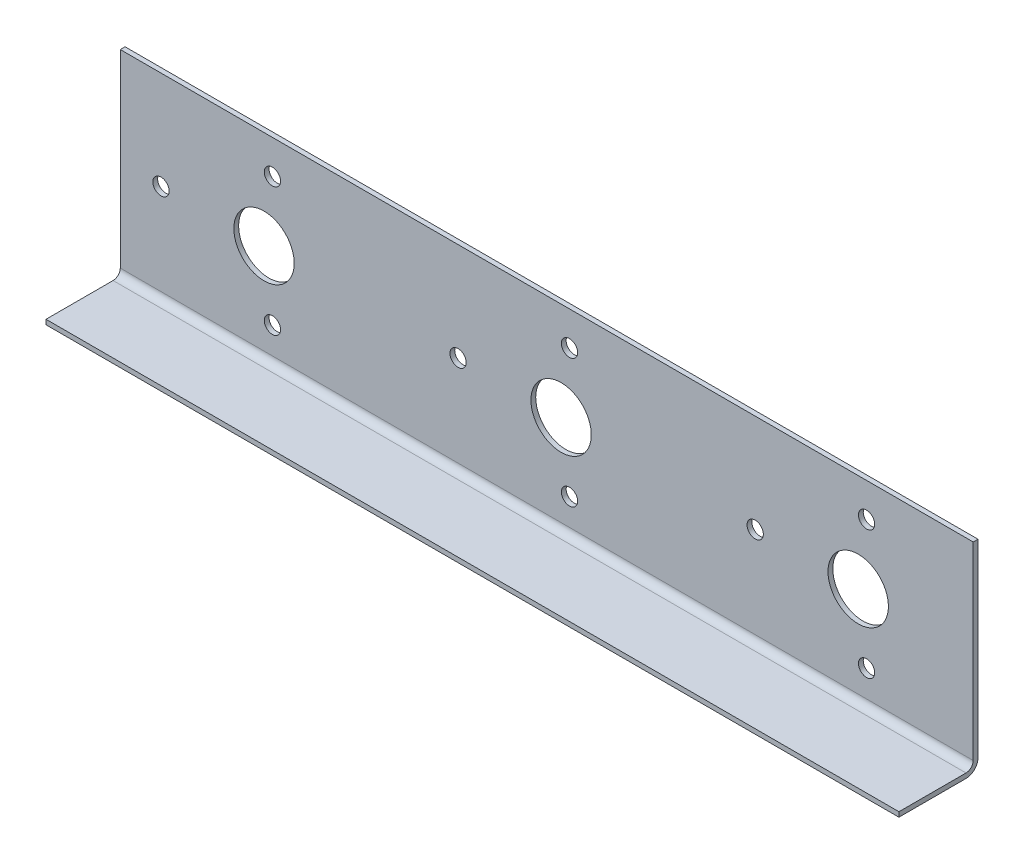
ISO-10303-21;
HEADER;
FILE_DESCRIPTION(('STEP AP214'),'2;1');
FILE_NAME('part.step','',(''),(''),'','','');
FILE_SCHEMA(('AUTOMOTIVE_DESIGN { 1 0 10303 214 1 1 1 1 }'));
ENDSEC;
DATA;
#1=APPLICATION_CONTEXT('core data for automotive mechanical design processes');
#2=APPLICATION_PROTOCOL_DEFINITION('international standard','automotive_design',2000,#1);
#3=PRODUCT_CONTEXT('',#1,'mechanical');
#4=PRODUCT('Part','Part','',(#3));
#5=PRODUCT_RELATED_PRODUCT_CATEGORY('part','',(#4));
#6=PRODUCT_DEFINITION_FORMATION('','',#4);
#7=PRODUCT_DEFINITION_CONTEXT('part definition',#1,'design');
#8=PRODUCT_DEFINITION('design','',#6,#7);
#9=PRODUCT_DEFINITION_SHAPE('','',#8);
#10=(LENGTH_UNIT() NAMED_UNIT(*) SI_UNIT(.MILLI.,.METRE.));
#11=(NAMED_UNIT(*) PLANE_ANGLE_UNIT() SI_UNIT($,.RADIAN.));
#12=(NAMED_UNIT(*) SI_UNIT($,.STERADIAN.) SOLID_ANGLE_UNIT());
#13=UNCERTAINTY_MEASURE_WITH_UNIT(LENGTH_MEASURE(1.E-05),#10,'distance_accuracy_value','');
#14=(GEOMETRIC_REPRESENTATION_CONTEXT(3) GLOBAL_UNCERTAINTY_ASSIGNED_CONTEXT((#13)) GLOBAL_UNIT_ASSIGNED_CONTEXT((#10,
#11,#12)) REPRESENTATION_CONTEXT('',''));
#15=CARTESIAN_POINT('',(0.,0.,0.));
#16=DIRECTION('',(0.,0.,1.));
#17=DIRECTION('',(1.,0.,0.));
#18=AXIS2_PLACEMENT_3D('',#15,#16,#17);
#19=CARTESIAN_POINT('',(-60.25,41.923393758659,-98.));
#20=DIRECTION('',(0.,0.,-1.));
#21=DIRECTION('',(-1.,0.,0.));
#22=AXIS2_PLACEMENT_3D('',#19,#20,#21);
#23=CYLINDRICAL_SURFACE('',#22,1.7);
#24=CARTESIAN_POINT('',(-60.25,41.923393758659,-101.));
#25=DIRECTION('',(0.,0.,-1.));
#26=DIRECTION('',(-1.,0.,0.));
#27=AXIS2_PLACEMENT_3D('',#24,#25,#26);
#28=CIRCLE('',#27,1.7);
#29=CARTESIAN_POINT('',(-61.95,41.923393758659,-101.));
#30=VERTEX_POINT('',#29);
#31=EDGE_CURVE('E259',#30,#30,#28,.T.);
#32=ORIENTED_EDGE('',*,*,#31,.T.);
#33=EDGE_LOOP('',(#32));
#34=FACE_BOUND('',#33,.T.);
#35=CARTESIAN_POINT('',(-60.25,41.923393758659,-100.));
#36=DIRECTION('',(0.,0.,-1.));
#37=DIRECTION('',(-1.,0.,0.));
#38=AXIS2_PLACEMENT_3D('',#35,#36,#37);
#39=CIRCLE('',#38,1.7);
#40=CARTESIAN_POINT('',(-61.95,41.923393758659,-100.));
#41=VERTEX_POINT('',#40);
#42=EDGE_CURVE('E157',#41,#41,#39,.T.);
#43=ORIENTED_EDGE('',*,*,#42,.F.);
#44=EDGE_LOOP('',(#43));
#45=FACE_BOUND('',#44,.T.);
#46=ADVANCED_FACE('F17',(#34,#45),#23,.F.);
#47=CARTESIAN_POINT('',(-83.5,28.5,-98.));
#48=DIRECTION('',(0.,0.,-1.));
#49=DIRECTION('',(-1.,0.,0.));
#50=AXIS2_PLACEMENT_3D('',#47,#48,#49);
#51=CYLINDRICAL_SURFACE('',#50,1.7);
#52=CARTESIAN_POINT('',(-83.5,28.5,-101.));
#53=DIRECTION('',(0.,0.,-1.));
#54=DIRECTION('',(-1.,0.,0.));
#55=AXIS2_PLACEMENT_3D('',#52,#53,#54);
#56=CIRCLE('',#55,1.7);
#57=CARTESIAN_POINT('',(-85.2,28.5,-101.));
#58=VERTEX_POINT('',#57);
#59=EDGE_CURVE('E255',#58,#58,#56,.T.);
#60=ORIENTED_EDGE('',*,*,#59,.T.);
#61=EDGE_LOOP('',(#60));
#62=FACE_BOUND('',#61,.T.);
#63=CARTESIAN_POINT('',(-83.5,28.5,-100.));
#64=DIRECTION('',(0.,0.,-1.));
#65=DIRECTION('',(-1.,0.,0.));
#66=AXIS2_PLACEMENT_3D('',#63,#64,#65);
#67=CIRCLE('',#66,1.7);
#68=CARTESIAN_POINT('',(-85.2,28.5,-100.));
#69=VERTEX_POINT('',#68);
#70=EDGE_CURVE('E153',#69,#69,#67,.T.);
#71=ORIENTED_EDGE('',*,*,#70,.F.);
#72=EDGE_LOOP('',(#71));
#73=FACE_BOUND('',#72,.T.);
#74=ADVANCED_FACE('F364',(#62,#73),#51,.F.);
#75=CARTESIAN_POINT('',(-62.,28.5,-98.));
#76=DIRECTION('',(0.,0.,-1.));
#77=DIRECTION('',(-1.,0.,0.));
#78=AXIS2_PLACEMENT_3D('',#75,#76,#77);
#79=CYLINDRICAL_SURFACE('',#78,6.3);
#80=CARTESIAN_POINT('',(-62.,28.5,-101.));
#81=DIRECTION('',(0.,0.,-1.));
#82=DIRECTION('',(-1.,0.,0.));
#83=AXIS2_PLACEMENT_3D('',#80,#81,#82);
#84=CIRCLE('',#83,6.3);
#85=CARTESIAN_POINT('',(-68.3,28.5,-101.));
#86=VERTEX_POINT('',#85);
#87=EDGE_CURVE('E25',#86,#86,#84,.T.);
#88=ORIENTED_EDGE('',*,*,#87,.T.);
#89=EDGE_LOOP('',(#88));
#90=FACE_BOUND('',#89,.T.);
#91=CARTESIAN_POINT('',(-62.,28.5,-100.));
#92=DIRECTION('',(0.,0.,-1.));
#93=DIRECTION('',(-1.,0.,0.));
#94=AXIS2_PLACEMENT_3D('',#91,#92,#93);
#95=CIRCLE('',#94,6.3);
#96=CARTESIAN_POINT('',(-68.3,28.5,-100.));
#97=VERTEX_POINT('',#96);
#98=EDGE_CURVE('E158',#97,#97,#95,.T.);
#99=ORIENTED_EDGE('',*,*,#98,.F.);
#100=EDGE_LOOP('',(#99));
#101=FACE_BOUND('',#100,.T.);
#102=ADVANCED_FACE('F292',(#90,#101),#79,.F.);
#103=CARTESIAN_POINT('',(-21.5,28.5,-98.));
#104=DIRECTION('',(0.,0.,-1.));
#105=DIRECTION('',(-1.,0.,0.));
#106=AXIS2_PLACEMENT_3D('',#103,#104,#105);
#107=CYLINDRICAL_SURFACE('',#106,1.7);
#108=CARTESIAN_POINT('',(-21.5,28.5,-101.));
#109=DIRECTION('',(0.,0.,-1.));
#110=DIRECTION('',(-1.,0.,0.));
#111=AXIS2_PLACEMENT_3D('',#108,#109,#110);
#112=CIRCLE('',#111,1.7);
#113=CARTESIAN_POINT('',(-23.2,28.5,-101.));
#114=VERTEX_POINT('',#113);
#115=EDGE_CURVE('E234',#114,#114,#112,.T.);
#116=ORIENTED_EDGE('',*,*,#115,.T.);
#117=EDGE_LOOP('',(#116));
#118=FACE_BOUND('',#117,.T.);
#119=CARTESIAN_POINT('',(-21.5,28.5,-100.));
#120=DIRECTION('',(0.,0.,-1.));
#121=DIRECTION('',(-1.,0.,0.));
#122=AXIS2_PLACEMENT_3D('',#119,#120,#121);
#123=CIRCLE('',#122,1.7);
#124=CARTESIAN_POINT('',(-23.2,28.5,-100.));
#125=VERTEX_POINT('',#124);
#126=EDGE_CURVE('E145',#125,#125,#123,.T.);
#127=ORIENTED_EDGE('',*,*,#126,.F.);
#128=EDGE_LOOP('',(#127));
#129=FACE_BOUND('',#128,.T.);
#130=ADVANCED_FACE('F400',(#118,#129),#107,.F.);
#131=CARTESIAN_POINT('',(-60.25,15.076606241341,-98.));
#132=DIRECTION('',(0.,0.,-1.));
#133=DIRECTION('',(-1.,0.,0.));
#134=AXIS2_PLACEMENT_3D('',#131,#132,#133);
#135=CYLINDRICAL_SURFACE('',#134,1.7);
#136=CARTESIAN_POINT('',(-60.25,15.076606241341,-101.));
#137=DIRECTION('',(0.,0.,-1.));
#138=DIRECTION('',(-1.,0.,0.));
#139=AXIS2_PLACEMENT_3D('',#136,#137,#138);
#140=CIRCLE('',#139,1.7);
#141=CARTESIAN_POINT('',(-61.95,15.076606241341,-101.));
#142=VERTEX_POINT('',#141);
#143=EDGE_CURVE('E11',#142,#142,#140,.T.);
#144=ORIENTED_EDGE('',*,*,#143,.T.);
#145=EDGE_LOOP('',(#144));
#146=FACE_BOUND('',#145,.T.);
#147=CARTESIAN_POINT('',(-60.25,15.076606241341,-100.));
#148=DIRECTION('',(0.,0.,-1.));
#149=DIRECTION('',(-1.,0.,0.));
#150=AXIS2_PLACEMENT_3D('',#147,#148,#149);
#151=CIRCLE('',#150,1.7);
#152=CARTESIAN_POINT('',(-61.95,15.076606241341,-100.));
#153=VERTEX_POINT('',#152);
#154=EDGE_CURVE('E239',#153,#153,#151,.T.);
#155=ORIENTED_EDGE('',*,*,#154,.F.);
#156=EDGE_LOOP('',(#155));
#157=FACE_BOUND('',#156,.T.);
#158=ADVANCED_FACE('F393',(#146,#157),#135,.F.);
#159=CARTESIAN_POINT('',(1.75,41.923393758659,-98.));
#160=DIRECTION('',(0.,0.,-1.));
#161=DIRECTION('',(-1.,0.,0.));
#162=AXIS2_PLACEMENT_3D('',#159,#160,#161);
#163=CYLINDRICAL_SURFACE('',#162,1.7);
#164=CARTESIAN_POINT('',(1.75,41.923393758659,-101.));
#165=DIRECTION('',(0.,0.,-1.));
#166=DIRECTION('',(-1.,0.,0.));
#167=AXIS2_PLACEMENT_3D('',#164,#165,#166);
#168=CIRCLE('',#167,1.7);
#169=CARTESIAN_POINT('',(0.0500000000000001,41.923393758659,-101.));
#170=VERTEX_POINT('',#169);
#171=EDGE_CURVE('E267',#170,#170,#168,.T.);
#172=ORIENTED_EDGE('',*,*,#171,.T.);
#173=EDGE_LOOP('',(#172));
#174=FACE_BOUND('',#173,.T.);
#175=CARTESIAN_POINT('',(1.75,41.923393758659,-100.));
#176=DIRECTION('',(0.,0.,-1.));
#177=DIRECTION('',(-1.,0.,0.));
#178=AXIS2_PLACEMENT_3D('',#175,#176,#177);
#179=CIRCLE('',#178,1.7);
#180=CARTESIAN_POINT('',(0.0500000000000001,41.923393758659,-100.));
#181=VERTEX_POINT('',#180);
#182=EDGE_CURVE('E229',#181,#181,#179,.T.);
#183=ORIENTED_EDGE('',*,*,#182,.F.);
#184=EDGE_LOOP('',(#183));
#185=FACE_BOUND('',#184,.T.);
#186=ADVANCED_FACE('F387',(#174,#185),#163,.F.);
#187=CARTESIAN_POINT('',(0.,28.5,-98.));
#188=DIRECTION('',(0.,0.,-1.));
#189=DIRECTION('',(-1.,0.,0.));
#190=AXIS2_PLACEMENT_3D('',#187,#188,#189);
#191=CYLINDRICAL_SURFACE('',#190,6.3);
#192=CARTESIAN_POINT('',(0.,28.5,-101.));
#193=DIRECTION('',(0.,0.,-1.));
#194=DIRECTION('',(-1.,0.,0.));
#195=AXIS2_PLACEMENT_3D('',#192,#193,#194);
#196=CIRCLE('',#195,6.3);
#197=CARTESIAN_POINT('',(-6.3,28.5,-101.));
#198=VERTEX_POINT('',#197);
#199=EDGE_CURVE('E235',#198,#198,#196,.T.);
#200=ORIENTED_EDGE('',*,*,#199,.T.);
#201=EDGE_LOOP('',(#200));
#202=FACE_BOUND('',#201,.T.);
#203=CARTESIAN_POINT('',(0.,28.5,-100.));
#204=DIRECTION('',(0.,0.,-1.));
#205=DIRECTION('',(-1.,0.,0.));
#206=AXIS2_PLACEMENT_3D('',#203,#204,#205);
#207=CIRCLE('',#206,6.3);
#208=CARTESIAN_POINT('',(-6.3,28.5,-100.));
#209=VERTEX_POINT('',#208);
#210=EDGE_CURVE('E225',#209,#209,#207,.T.);
#211=ORIENTED_EDGE('',*,*,#210,.F.);
#212=EDGE_LOOP('',(#211));
#213=FACE_BOUND('',#212,.T.);
#214=ADVANCED_FACE('F326',(#202,#213),#191,.F.);
#215=CARTESIAN_POINT('',(63.75,41.923393758659,-98.));
#216=DIRECTION('',(0.,0.,-1.));
#217=DIRECTION('',(-1.,0.,0.));
#218=AXIS2_PLACEMENT_3D('',#215,#216,#217);
#219=CYLINDRICAL_SURFACE('',#218,1.7);
#220=CARTESIAN_POINT('',(63.75,41.923393758659,-101.));
#221=DIRECTION('',(0.,0.,-1.));
#222=DIRECTION('',(-1.,0.,0.));
#223=AXIS2_PLACEMENT_3D('',#220,#221,#222);
#224=CIRCLE('',#223,1.7);
#225=CARTESIAN_POINT('',(62.05,41.923393758659,-101.));
#226=VERTEX_POINT('',#225);
#227=EDGE_CURVE('E254',#226,#226,#224,.T.);
#228=ORIENTED_EDGE('',*,*,#227,.T.);
#229=EDGE_LOOP('',(#228));
#230=FACE_BOUND('',#229,.T.);
#231=CARTESIAN_POINT('',(63.75,41.923393758659,-100.));
#232=DIRECTION('',(0.,0.,-1.));
#233=DIRECTION('',(-1.,0.,0.));
#234=AXIS2_PLACEMENT_3D('',#231,#232,#233);
#235=CIRCLE('',#234,1.7);
#236=CARTESIAN_POINT('',(62.05,41.923393758659,-100.));
#237=VERTEX_POINT('',#236);
#238=EDGE_CURVE('E221',#237,#237,#235,.T.);
#239=ORIENTED_EDGE('',*,*,#238,.F.);
#240=EDGE_LOOP('',(#239));
#241=FACE_BOUND('',#240,.T.);
#242=ADVANCED_FACE('F322',(#230,#241),#219,.F.);
#243=CARTESIAN_POINT('',(40.5,28.5,-98.));
#244=DIRECTION('',(0.,0.,-1.));
#245=DIRECTION('',(-1.,0.,0.));
#246=AXIS2_PLACEMENT_3D('',#243,#244,#245);
#247=CYLINDRICAL_SURFACE('',#246,1.7);
#248=CARTESIAN_POINT('',(40.5,28.5,-101.));
#249=DIRECTION('',(0.,0.,-1.));
#250=DIRECTION('',(-1.,0.,0.));
#251=AXIS2_PLACEMENT_3D('',#248,#249,#250);
#252=CIRCLE('',#251,1.7);
#253=CARTESIAN_POINT('',(38.8,28.5,-101.));
#254=VERTEX_POINT('',#253);
#255=EDGE_CURVE('E263',#254,#254,#252,.T.);
#256=ORIENTED_EDGE('',*,*,#255,.T.);
#257=EDGE_LOOP('',(#256));
#258=FACE_BOUND('',#257,.T.);
#259=CARTESIAN_POINT('',(40.5,28.5,-100.));
#260=DIRECTION('',(0.,0.,-1.));
#261=DIRECTION('',(-1.,0.,0.));
#262=AXIS2_PLACEMENT_3D('',#259,#260,#261);
#263=CIRCLE('',#262,1.7);
#264=CARTESIAN_POINT('',(38.8,28.5,-100.));
#265=VERTEX_POINT('',#264);
#266=EDGE_CURVE('E217',#265,#265,#263,.T.);
#267=ORIENTED_EDGE('',*,*,#266,.F.);
#268=EDGE_LOOP('',(#267));
#269=FACE_BOUND('',#268,.T.);
#270=ADVANCED_FACE('F325',(#258,#269),#247,.F.);
#271=CARTESIAN_POINT('',(62.,28.5,-98.));
#272=DIRECTION('',(0.,0.,-1.));
#273=DIRECTION('',(-1.,0.,0.));
#274=AXIS2_PLACEMENT_3D('',#271,#272,#273);
#275=CYLINDRICAL_SURFACE('',#274,6.3);
#276=CARTESIAN_POINT('',(62.,28.5,-101.));
#277=DIRECTION('',(0.,0.,-1.));
#278=DIRECTION('',(-1.,0.,0.));
#279=AXIS2_PLACEMENT_3D('',#276,#277,#278);
#280=CIRCLE('',#279,6.3);
#281=CARTESIAN_POINT('',(55.7,28.5,-101.));
#282=VERTEX_POINT('',#281);
#283=EDGE_CURVE('E271',#282,#282,#280,.T.);
#284=ORIENTED_EDGE('',*,*,#283,.T.);
#285=EDGE_LOOP('',(#284));
#286=FACE_BOUND('',#285,.T.);
#287=CARTESIAN_POINT('',(62.,28.5,-100.));
#288=DIRECTION('',(0.,0.,-1.));
#289=DIRECTION('',(-1.,0.,0.));
#290=AXIS2_PLACEMENT_3D('',#287,#288,#289);
#291=CIRCLE('',#290,6.3);
#292=CARTESIAN_POINT('',(55.7,28.5,-100.));
#293=VERTEX_POINT('',#292);
#294=EDGE_CURVE('E213',#293,#293,#291,.T.);
#295=ORIENTED_EDGE('',*,*,#294,.F.);
#296=EDGE_LOOP('',(#295));
#297=FACE_BOUND('',#296,.T.);
#298=ADVANCED_FACE('F452',(#286,#297),#275,.F.);
#299=CARTESIAN_POINT('',(1.75,15.076606241341,-98.));
#300=DIRECTION('',(0.,0.,-1.));
#301=DIRECTION('',(-1.,0.,0.));
#302=AXIS2_PLACEMENT_3D('',#299,#300,#301);
#303=CYLINDRICAL_SURFACE('',#302,1.7);
#304=CARTESIAN_POINT('',(1.75,15.076606241341,-101.));
#305=DIRECTION('',(0.,0.,-1.));
#306=DIRECTION('',(-1.,0.,0.));
#307=AXIS2_PLACEMENT_3D('',#304,#305,#306);
#308=CIRCLE('',#307,1.7);
#309=CARTESIAN_POINT('',(0.0500000000000001,15.076606241341,-101.));
#310=VERTEX_POINT('',#309);
#311=EDGE_CURVE('E230',#310,#310,#308,.T.);
#312=ORIENTED_EDGE('',*,*,#311,.T.);
#313=EDGE_LOOP('',(#312));
#314=FACE_BOUND('',#313,.T.);
#315=CARTESIAN_POINT('',(1.75,15.076606241341,-100.));
#316=DIRECTION('',(0.,0.,-1.));
#317=DIRECTION('',(-1.,0.,0.));
#318=AXIS2_PLACEMENT_3D('',#315,#316,#317);
#319=CIRCLE('',#318,1.7);
#320=CARTESIAN_POINT('',(0.0500000000000001,15.076606241341,-100.));
#321=VERTEX_POINT('',#320);
#322=EDGE_CURVE('E199',#321,#321,#319,.T.);
#323=ORIENTED_EDGE('',*,*,#322,.F.);
#324=EDGE_LOOP('',(#323));
#325=FACE_BOUND('',#324,.T.);
#326=ADVANCED_FACE('F463',(#314,#325),#303,.F.);
#327=CARTESIAN_POINT('',(63.75,15.076606241341,-98.));
#328=DIRECTION('',(0.,0.,-1.));
#329=DIRECTION('',(-1.,0.,0.));
#330=AXIS2_PLACEMENT_3D('',#327,#328,#329);
#331=CYLINDRICAL_SURFACE('',#330,1.7);
#332=CARTESIAN_POINT('',(63.75,15.076606241341,-101.));
#333=DIRECTION('',(0.,0.,-1.));
#334=DIRECTION('',(-1.,0.,0.));
#335=AXIS2_PLACEMENT_3D('',#332,#333,#334);
#336=CIRCLE('',#335,1.7);
#337=CARTESIAN_POINT('',(62.05,15.076606241341,-101.));
#338=VERTEX_POINT('',#337);
#339=EDGE_CURVE('E275',#338,#338,#336,.T.);
#340=ORIENTED_EDGE('',*,*,#339,.T.);
#341=EDGE_LOOP('',(#340));
#342=FACE_BOUND('',#341,.T.);
#343=CARTESIAN_POINT('',(63.75,15.076606241341,-100.));
#344=DIRECTION('',(0.,0.,-1.));
#345=DIRECTION('',(-1.,0.,0.));
#346=AXIS2_PLACEMENT_3D('',#343,#344,#345);
#347=CIRCLE('',#346,1.7);
#348=CARTESIAN_POINT('',(62.05,15.076606241341,-100.));
#349=VERTEX_POINT('',#348);
#350=EDGE_CURVE('E195',#349,#349,#347,.T.);
#351=ORIENTED_EDGE('',*,*,#350,.F.);
#352=EDGE_LOOP('',(#351));
#353=FACE_BOUND('',#352,.T.);
#354=ADVANCED_FACE('F475',(#342,#353),#331,.F.);
#355=CARTESIAN_POINT('',(-92.,9.5,-98.5));
#356=DIRECTION('',(-1.,0.,0.));
#357=DIRECTION('',(0.,0.,-1.));
#358=AXIS2_PLACEMENT_3D('',#355,#356,#357);
#359=CYLINDRICAL_SURFACE('',#358,2.5);
#360=DIRECTION('',(1.,0.,0.));
#361=VECTOR('',#360,1.);
#362=CARTESIAN_POINT('',(-92.,9.5,-101.));
#363=LINE('',#362,#361);
#364=CARTESIAN_POINT('',(-92.,9.5,-101.));
#365=VERTEX_POINT('',#364);
#366=CARTESIAN_POINT('',(86.,9.5,-101.));
#367=VERTEX_POINT('',#366);
#368=EDGE_CURVE('E251',#365,#367,#363,.T.);
#369=ORIENTED_EDGE('',*,*,#368,.T.);
#370=CARTESIAN_POINT('',(86.,9.5,-98.5));
#371=DIRECTION('',(-1.,0.,0.));
#372=DIRECTION('',(0.,0.,-1.));
#373=AXIS2_PLACEMENT_3D('',#370,#371,#372);
#374=CIRCLE('',#373,2.5);
#375=CARTESIAN_POINT('',(86.,7.,-98.5));
#376=VERTEX_POINT('',#375);
#377=EDGE_CURVE('E187',#367,#376,#374,.T.);
#378=ORIENTED_EDGE('',*,*,#377,.T.);
#379=DIRECTION('',(1.,0.,0.));
#380=VECTOR('',#379,1.);
#381=CARTESIAN_POINT('',(-92.,7.,-98.5));
#382=LINE('',#381,#380);
#383=CARTESIAN_POINT('',(-92.,7.,-98.5));
#384=VERTEX_POINT('',#383);
#385=EDGE_CURVE('E205',#384,#376,#382,.T.);
#386=ORIENTED_EDGE('',*,*,#385,.F.);
#387=CARTESIAN_POINT('',(-92.,9.5,-98.5));
#388=DIRECTION('',(-1.,0.,0.));
#389=DIRECTION('',(0.,0.,-1.));
#390=AXIS2_PLACEMENT_3D('',#387,#388,#389);
#391=CIRCLE('',#390,2.5);
#392=EDGE_CURVE('E147',#365,#384,#391,.T.);
#393=ORIENTED_EDGE('',*,*,#392,.F.);
#394=EDGE_LOOP('',(#369,#378,#386,#393));
#395=FACE_BOUND('',#394,.T.);
#396=ADVANCED_FACE('F299',(#395),#359,.T.);
#397=CARTESIAN_POINT('',(-92.,49.,-101.));
#398=DIRECTION('',(0.,0.,-1.));
#399=DIRECTION('',(0.,-1.,0.));
#400=AXIS2_PLACEMENT_3D('',#397,#398,#399);
#401=PLANE('',#400);
#402=ORIENTED_EDGE('',*,*,#143,.F.);
#403=EDGE_LOOP('',(#402));
#404=FACE_BOUND('',#403,.T.);
#405=ORIENTED_EDGE('',*,*,#87,.F.);
#406=EDGE_LOOP('',(#405));
#407=FACE_BOUND('',#406,.T.);
#408=ORIENTED_EDGE('',*,*,#59,.F.);
#409=EDGE_LOOP('',(#408));
#410=FACE_BOUND('',#409,.T.);
#411=ORIENTED_EDGE('',*,*,#31,.F.);
#412=EDGE_LOOP('',(#411));
#413=FACE_BOUND('',#412,.T.);
#414=ORIENTED_EDGE('',*,*,#115,.F.);
#415=EDGE_LOOP('',(#414));
#416=FACE_BOUND('',#415,.T.);
#417=ORIENTED_EDGE('',*,*,#311,.F.);
#418=EDGE_LOOP('',(#417));
#419=FACE_BOUND('',#418,.T.);
#420=ORIENTED_EDGE('',*,*,#199,.F.);
#421=EDGE_LOOP('',(#420));
#422=FACE_BOUND('',#421,.T.);
#423=ORIENTED_EDGE('',*,*,#339,.F.);
#424=EDGE_LOOP('',(#423));
#425=FACE_BOUND('',#424,.T.);
#426=ORIENTED_EDGE('',*,*,#283,.F.);
#427=EDGE_LOOP('',(#426));
#428=FACE_BOUND('',#427,.T.);
#429=ORIENTED_EDGE('',*,*,#171,.F.);
#430=EDGE_LOOP('',(#429));
#431=FACE_BOUND('',#430,.T.);
#432=ORIENTED_EDGE('',*,*,#255,.F.);
#433=EDGE_LOOP('',(#432));
#434=FACE_BOUND('',#433,.T.);
#435=ORIENTED_EDGE('',*,*,#227,.F.);
#436=EDGE_LOOP('',(#435));
#437=FACE_BOUND('',#436,.T.);
#438=DIRECTION('',(1.,0.,0.));
#439=VECTOR('',#438,1.);
#440=CARTESIAN_POINT('',(-92.,49.,-101.));
#441=LINE('',#440,#439);
#442=CARTESIAN_POINT('',(-92.,49.,-101.));
#443=VERTEX_POINT('',#442);
#444=CARTESIAN_POINT('',(86.,49.,-101.));
#445=VERTEX_POINT('',#444);
#446=EDGE_CURVE('E47',#443,#445,#441,.T.);
#447=ORIENTED_EDGE('',*,*,#446,.T.);
#448=DIRECTION('',(0.,-1.,0.));
#449=VECTOR('',#448,1.);
#450=CARTESIAN_POINT('',(86.,49.,-101.));
#451=LINE('',#450,#449);
#452=EDGE_CURVE('E191',#445,#367,#451,.T.);
#453=ORIENTED_EDGE('',*,*,#452,.T.);
#454=ORIENTED_EDGE('',*,*,#368,.F.);
#455=DIRECTION('',(0.,-1.,0.));
#456=VECTOR('',#455,1.);
#457=CARTESIAN_POINT('',(-92.,49.,-101.));
#458=LINE('',#457,#456);
#459=EDGE_CURVE('E166',#443,#365,#458,.T.);
#460=ORIENTED_EDGE('',*,*,#459,.F.);
#461=EDGE_LOOP('',(#447,#453,#454,#460));
#462=FACE_BOUND('',#461,.T.);
#463=ADVANCED_FACE('F295',(#404,#407,#410,#413,#416,#419,#422,#425,#428,#431,#434,#437,#462),
#401,.T.);
#464=CARTESIAN_POINT('',(-92.,49.,-100.));
#465=DIRECTION('',(0.,1.,0.));
#466=DIRECTION('',(1.,0.,0.));
#467=AXIS2_PLACEMENT_3D('',#464,#465,#466);
#468=PLANE('',#467);
#469=DIRECTION('',(1.,0.,0.));
#470=VECTOR('',#469,1.);
#471=CARTESIAN_POINT('',(-92.,49.,-100.));
#472=LINE('',#471,#470);
#473=CARTESIAN_POINT('',(-92.,49.,-100.));
#474=VERTEX_POINT('',#473);
#475=CARTESIAN_POINT('',(86.,49.,-100.));
#476=VERTEX_POINT('',#475);
#477=EDGE_CURVE('E37',#474,#476,#472,.T.);
#478=ORIENTED_EDGE('',*,*,#477,.T.);
#479=DIRECTION('',(0.,0.,-1.));
#480=VECTOR('',#479,1.);
#481=CARTESIAN_POINT('',(86.,49.,-100.));
#482=LINE('',#481,#480);
#483=EDGE_CURVE('E194',#476,#445,#482,.T.);
#484=ORIENTED_EDGE('',*,*,#483,.T.);
#485=ORIENTED_EDGE('',*,*,#446,.F.);
#486=DIRECTION('',(0.,0.,-1.));
#487=VECTOR('',#486,1.);
#488=CARTESIAN_POINT('',(-92.,49.,-100.));
#489=LINE('',#488,#487);
#490=EDGE_CURVE('E172',#474,#443,#489,.T.);
#491=ORIENTED_EDGE('',*,*,#490,.F.);
#492=EDGE_LOOP('',(#478,#484,#485,#491));
#493=FACE_BOUND('',#492,.T.);
#494=ADVANCED_FACE('F298',(#493),#468,.T.);
#495=CARTESIAN_POINT('',(-92.,9.5,-100.));
#496=DIRECTION('',(0.,0.,1.));
#497=DIRECTION('',(1.,0.,0.));
#498=AXIS2_PLACEMENT_3D('',#495,#496,#497);
#499=PLANE('',#498);
#500=ORIENTED_EDGE('',*,*,#42,.T.);
#501=EDGE_LOOP('',(#500));
#502=FACE_BOUND('',#501,.T.);
#503=ORIENTED_EDGE('',*,*,#70,.T.);
#504=EDGE_LOOP('',(#503));
#505=FACE_BOUND('',#504,.T.);
#506=ORIENTED_EDGE('',*,*,#98,.T.);
#507=EDGE_LOOP('',(#506));
#508=FACE_BOUND('',#507,.T.);
#509=ORIENTED_EDGE('',*,*,#126,.T.);
#510=EDGE_LOOP('',(#509));
#511=FACE_BOUND('',#510,.T.);
#512=ORIENTED_EDGE('',*,*,#154,.T.);
#513=EDGE_LOOP('',(#512));
#514=FACE_BOUND('',#513,.T.);
#515=ORIENTED_EDGE('',*,*,#182,.T.);
#516=EDGE_LOOP('',(#515));
#517=FACE_BOUND('',#516,.T.);
#518=ORIENTED_EDGE('',*,*,#210,.T.);
#519=EDGE_LOOP('',(#518));
#520=FACE_BOUND('',#519,.T.);
#521=ORIENTED_EDGE('',*,*,#238,.T.);
#522=EDGE_LOOP('',(#521));
#523=FACE_BOUND('',#522,.T.);
#524=ORIENTED_EDGE('',*,*,#266,.T.);
#525=EDGE_LOOP('',(#524));
#526=FACE_BOUND('',#525,.T.);
#527=ORIENTED_EDGE('',*,*,#294,.T.);
#528=EDGE_LOOP('',(#527));
#529=FACE_BOUND('',#528,.T.);
#530=ORIENTED_EDGE('',*,*,#322,.T.);
#531=EDGE_LOOP('',(#530));
#532=FACE_BOUND('',#531,.T.);
#533=ORIENTED_EDGE('',*,*,#350,.T.);
#534=EDGE_LOOP('',(#533));
#535=FACE_BOUND('',#534,.T.);
#536=DIRECTION('',(1.,0.,0.));
#537=VECTOR('',#536,1.);
#538=CARTESIAN_POINT('',(-92.,9.5,-100.));
#539=LINE('',#538,#537);
#540=CARTESIAN_POINT('',(-92.,9.5,-100.));
#541=VERTEX_POINT('',#540);
#542=CARTESIAN_POINT('',(86.,9.5,-100.));
#543=VERTEX_POINT('',#542);
#544=EDGE_CURVE('E152',#541,#543,#539,.T.);
#545=ORIENTED_EDGE('',*,*,#544,.T.);
#546=DIRECTION('',(0.,1.,0.));
#547=VECTOR('',#546,1.);
#548=CARTESIAN_POINT('',(86.,9.5,-100.));
#549=LINE('',#548,#547);
#550=EDGE_CURVE('E202',#543,#476,#549,.T.);
#551=ORIENTED_EDGE('',*,*,#550,.T.);
#552=ORIENTED_EDGE('',*,*,#477,.F.);
#553=DIRECTION('',(0.,1.,0.));
#554=VECTOR('',#553,1.);
#555=CARTESIAN_POINT('',(-92.,9.5,-100.));
#556=LINE('',#555,#554);
#557=EDGE_CURVE('E176',#541,#474,#556,.T.);
#558=ORIENTED_EDGE('',*,*,#557,.F.);
#559=EDGE_LOOP('',(#545,#551,#552,#558));
#560=FACE_BOUND('',#559,.T.);
#561=ADVANCED_FACE('F330',(#502,#505,#508,#511,#514,#517,#520,#523,#526,#529,#532,#535,#560),
#499,.T.);
#562=CARTESIAN_POINT('',(-92.,7.,-98.5));
#563=DIRECTION('',(0.,-1.,0.));
#564=DIRECTION('',(0.,0.,-1.));
#565=AXIS2_PLACEMENT_3D('',#562,#563,#564);
#566=PLANE('',#565);
#567=ORIENTED_EDGE('',*,*,#385,.T.);
#568=DIRECTION('',(0.,0.,1.));
#569=VECTOR('',#568,1.);
#570=CARTESIAN_POINT('',(86.,7.,-98.5));
#571=LINE('',#570,#569);
#572=CARTESIAN_POINT('',(86.,7.,-84.5));
#573=VERTEX_POINT('',#572);
#574=EDGE_CURVE('E146',#376,#573,#571,.T.);
#575=ORIENTED_EDGE('',*,*,#574,.T.);
#576=DIRECTION('',(1.,0.,0.));
#577=VECTOR('',#576,1.);
#578=CARTESIAN_POINT('',(-92.,7.,-84.5));
#579=LINE('',#578,#577);
#580=CARTESIAN_POINT('',(-92.,7.,-84.5));
#581=VERTEX_POINT('',#580);
#582=EDGE_CURVE('E130',#581,#573,#579,.T.);
#583=ORIENTED_EDGE('',*,*,#582,.F.);
#584=DIRECTION('',(0.,0.,1.));
#585=VECTOR('',#584,1.);
#586=CARTESIAN_POINT('',(-92.,7.,-98.5));
#587=LINE('',#586,#585);
#588=EDGE_CURVE('E113',#384,#581,#587,.T.);
#589=ORIENTED_EDGE('',*,*,#588,.F.);
#590=EDGE_LOOP('',(#567,#575,#583,#589));
#591=FACE_BOUND('',#590,.T.);
#592=ADVANCED_FACE('F333',(#591),#566,.T.);
#593=CARTESIAN_POINT('',(86.,22.810629057084,-98.13727949467));
#594=DIRECTION('',(-1.,0.,0.));
#595=DIRECTION('',(0.,0.,1.));
#596=AXIS2_PLACEMENT_3D('',#593,#594,#595);
#597=PLANE('',#596);
#598=DIRECTION('',(0.,1.,0.));
#599=VECTOR('',#598,1.);
#600=CARTESIAN_POINT('',(86.,7.,-84.5));
#601=LINE('',#600,#599);
#602=CARTESIAN_POINT('',(86.,8.,-84.5));
#603=VERTEX_POINT('',#602);
#604=EDGE_CURVE('E120',#573,#603,#601,.T.);
#605=ORIENTED_EDGE('',*,*,#604,.F.);
#606=ORIENTED_EDGE('',*,*,#574,.F.);
#607=ORIENTED_EDGE('',*,*,#377,.F.);
#608=ORIENTED_EDGE('',*,*,#452,.F.);
#609=ORIENTED_EDGE('',*,*,#483,.F.);
#610=ORIENTED_EDGE('',*,*,#550,.F.);
#611=CARTESIAN_POINT('',(86.,9.5,-98.5));
#612=DIRECTION('',(1.,0.,0.));
#613=DIRECTION('',(0.,-1.,0.));
#614=AXIS2_PLACEMENT_3D('',#611,#612,#613);
#615=CIRCLE('',#614,1.5);
#616=CARTESIAN_POINT('',(86.,8.,-98.5));
#617=VERTEX_POINT('',#616);
#618=EDGE_CURVE('E119',#617,#543,#615,.T.);
#619=ORIENTED_EDGE('',*,*,#618,.F.);
#620=DIRECTION('',(0.,0.,-1.));
#621=VECTOR('',#620,1.);
#622=CARTESIAN_POINT('',(86.,8.,-84.5));
#623=LINE('',#622,#621);
#624=EDGE_CURVE('E136',#603,#617,#623,.T.);
#625=ORIENTED_EDGE('',*,*,#624,.F.);
#626=EDGE_LOOP('',(#605,#606,#607,#608,#609,#610,#619,#625));
#627=FACE_BOUND('',#626,.T.);
#628=ADVANCED_FACE('F349',(#627),#597,.F.);
#629=CARTESIAN_POINT('',(-92.,22.810629057084,-98.13727949467));
#630=DIRECTION('',(-1.,0.,0.));
#631=DIRECTION('',(0.,0.,1.));
#632=AXIS2_PLACEMENT_3D('',#629,#630,#631);
#633=PLANE('',#632);
#634=DIRECTION('',(0.,0.,-1.));
#635=VECTOR('',#634,1.);
#636=CARTESIAN_POINT('',(-92.,8.,-84.5));
#637=LINE('',#636,#635);
#638=CARTESIAN_POINT('',(-92.,8.,-84.5));
#639=VERTEX_POINT('',#638);
#640=CARTESIAN_POINT('',(-92.,8.,-98.5));
#641=VERTEX_POINT('',#640);
#642=EDGE_CURVE('E109',#639,#641,#637,.T.);
#643=ORIENTED_EDGE('',*,*,#642,.T.);
#644=CARTESIAN_POINT('',(-92.,9.5,-98.5));
#645=DIRECTION('',(1.,0.,0.));
#646=DIRECTION('',(0.,-1.,0.));
#647=AXIS2_PLACEMENT_3D('',#644,#645,#646);
#648=CIRCLE('',#647,1.5);
#649=EDGE_CURVE('E171',#641,#541,#648,.T.);
#650=ORIENTED_EDGE('',*,*,#649,.T.);
#651=ORIENTED_EDGE('',*,*,#557,.T.);
#652=ORIENTED_EDGE('',*,*,#490,.T.);
#653=ORIENTED_EDGE('',*,*,#459,.T.);
#654=ORIENTED_EDGE('',*,*,#392,.T.);
#655=ORIENTED_EDGE('',*,*,#588,.T.);
#656=DIRECTION('',(0.,1.,0.));
#657=VECTOR('',#656,1.);
#658=CARTESIAN_POINT('',(-92.,7.,-84.5));
#659=LINE('',#658,#657);
#660=EDGE_CURVE('E105',#581,#639,#659,.T.);
#661=ORIENTED_EDGE('',*,*,#660,.T.);
#662=EDGE_LOOP('',(#643,#650,#651,#652,#653,#654,#655,#661));
#663=FACE_BOUND('',#662,.T.);
#664=ADVANCED_FACE('F107',(#663),#633,.T.);
#665=CARTESIAN_POINT('',(-92.,9.5,-98.5));
#666=DIRECTION('',(-1.,0.,0.));
#667=DIRECTION('',(0.,-1.,0.));
#668=AXIS2_PLACEMENT_3D('',#665,#666,#667);
#669=CYLINDRICAL_SURFACE('',#668,1.5);
#670=DIRECTION('',(1.,0.,0.));
#671=VECTOR('',#670,1.);
#672=CARTESIAN_POINT('',(-92.,8.,-98.5));
#673=LINE('',#672,#671);
#674=EDGE_CURVE('E128',#641,#617,#673,.T.);
#675=ORIENTED_EDGE('',*,*,#674,.T.);
#676=ORIENTED_EDGE('',*,*,#618,.T.);
#677=ORIENTED_EDGE('',*,*,#544,.F.);
#678=ORIENTED_EDGE('',*,*,#649,.F.);
#679=EDGE_LOOP('',(#675,#676,#677,#678));
#680=FACE_BOUND('',#679,.T.);
#681=ADVANCED_FACE('F347',(#680),#669,.F.);
#682=CARTESIAN_POINT('',(-92.,7.,-84.5));
#683=DIRECTION('',(0.,0.,1.));
#684=DIRECTION('',(1.,0.,0.));
#685=AXIS2_PLACEMENT_3D('',#682,#683,#684);
#686=PLANE('',#685);
#687=ORIENTED_EDGE('',*,*,#582,.T.);
#688=ORIENTED_EDGE('',*,*,#604,.T.);
#689=DIRECTION('',(1.,0.,0.));
#690=VECTOR('',#689,1.);
#691=CARTESIAN_POINT('',(-92.,8.,-84.5));
#692=LINE('',#691,#690);
#693=EDGE_CURVE('E126',#639,#603,#692,.T.);
#694=ORIENTED_EDGE('',*,*,#693,.F.);
#695=ORIENTED_EDGE('',*,*,#660,.F.);
#696=EDGE_LOOP('',(#687,#688,#694,#695));
#697=FACE_BOUND('',#696,.T.);
#698=ADVANCED_FACE('F132',(#697),#686,.T.);
#699=CARTESIAN_POINT('',(-92.,8.,-84.5));
#700=DIRECTION('',(0.,1.,0.));
#701=DIRECTION('',(1.,0.,0.));
#702=AXIS2_PLACEMENT_3D('',#699,#700,#701);
#703=PLANE('',#702);
#704=ORIENTED_EDGE('',*,*,#693,.T.);
#705=ORIENTED_EDGE('',*,*,#624,.T.);
#706=ORIENTED_EDGE('',*,*,#674,.F.);
#707=ORIENTED_EDGE('',*,*,#642,.F.);
#708=EDGE_LOOP('',(#704,#705,#706,#707));
#709=FACE_BOUND('',#708,.T.);
#710=ADVANCED_FACE('F124',(#709),#703,.T.);
#711=CLOSED_SHELL('',(#46,#74,#102,#130,#158,#186,#214,#242,#270,#298,#326,#354,#396,#463,#494,
#561,#592,#628,#664,#681,#698,#710));
#712=MANIFOLD_SOLID_BREP('B1',#711);
#713=ADVANCED_BREP_SHAPE_REPRESENTATION('',(#18,#712),#14);
#714=SHAPE_DEFINITION_REPRESENTATION(#9,#713);
ENDSEC;
END-ISO-10303-21;
